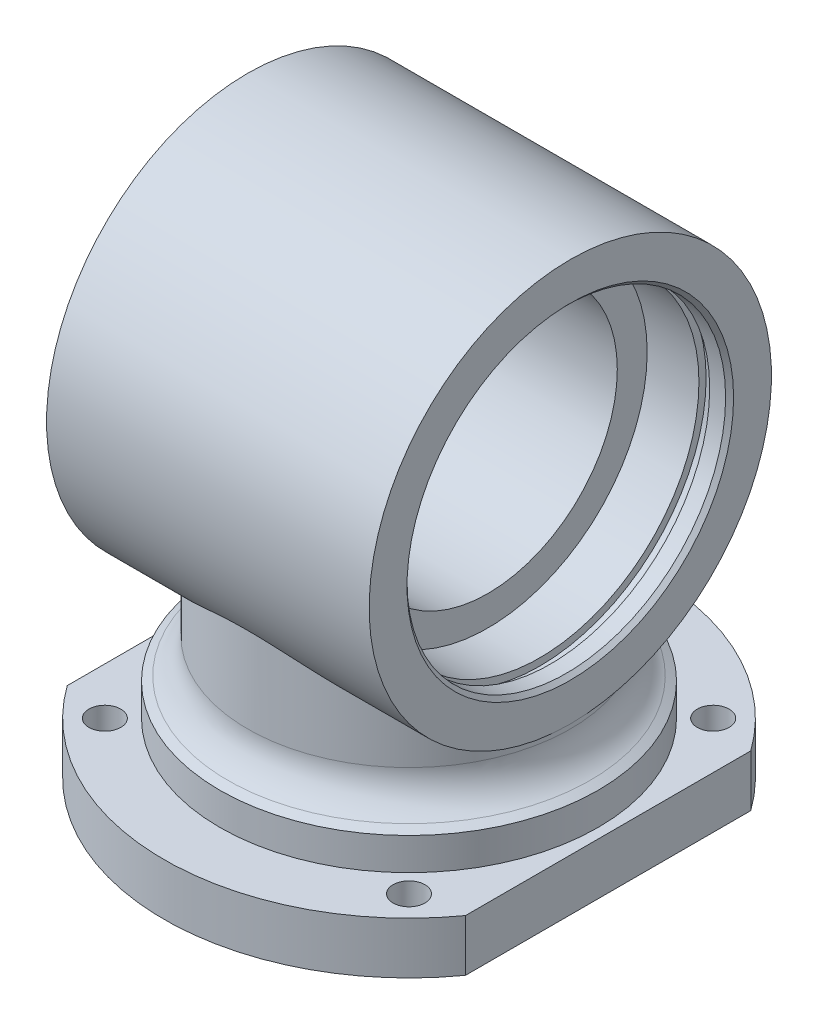
ISO-10303-21;
HEADER;
FILE_DESCRIPTION(('STEP AP214'),'2;1');
FILE_NAME('part.step','',(''),(''),'','','');
FILE_SCHEMA(('AUTOMOTIVE_DESIGN { 1 0 10303 214 1 1 1 1 }'));
ENDSEC;
DATA;
#1=APPLICATION_CONTEXT('core data for automotive mechanical design processes');
#2=APPLICATION_PROTOCOL_DEFINITION('international standard','automotive_design',2000,#1);
#3=PRODUCT_CONTEXT('',#1,'mechanical');
#4=PRODUCT('Part','Part','',(#3));
#5=PRODUCT_RELATED_PRODUCT_CATEGORY('part','',(#4));
#6=PRODUCT_DEFINITION_FORMATION('','',#4);
#7=PRODUCT_DEFINITION_CONTEXT('part definition',#1,'design');
#8=PRODUCT_DEFINITION('design','',#6,#7);
#9=PRODUCT_DEFINITION_SHAPE('','',#8);
#10=(LENGTH_UNIT() NAMED_UNIT(*) SI_UNIT(.MILLI.,.METRE.));
#11=(NAMED_UNIT(*) PLANE_ANGLE_UNIT() SI_UNIT($,.RADIAN.));
#12=(NAMED_UNIT(*) SI_UNIT($,.STERADIAN.) SOLID_ANGLE_UNIT());
#13=UNCERTAINTY_MEASURE_WITH_UNIT(LENGTH_MEASURE(1.E-05),#10,'distance_accuracy_value','');
#14=(GEOMETRIC_REPRESENTATION_CONTEXT(3) GLOBAL_UNCERTAINTY_ASSIGNED_CONTEXT((#13)) GLOBAL_UNIT_ASSIGNED_CONTEXT((#10,
#11,#12)) REPRESENTATION_CONTEXT('',''));
#15=CARTESIAN_POINT('',(0.,0.,0.));
#16=DIRECTION('',(0.,0.,1.));
#17=DIRECTION('',(1.,0.,0.));
#18=AXIS2_PLACEMENT_3D('',#15,#16,#17);
#19=CARTESIAN_POINT('',(0.,22.2376043070339,0.));
#20=DIRECTION('',(0.,-1.,0.));
#21=DIRECTION('',(0.,0.,-1.));
#22=AXIS2_PLACEMENT_3D('',#19,#20,#21);
#23=CONICAL_SURFACE('',#22,45.5,1.0471975511966);
#24=CARTESIAN_POINT('',(0.,22.2376043070339,0.));
#25=DIRECTION('',(0.,-1.,0.));
#26=DIRECTION('',(0.,0.,-1.));
#27=AXIS2_PLACEMENT_3D('',#24,#25,#26);
#28=CIRCLE('',#27,45.5);
#29=CARTESIAN_POINT('',(0.,22.2376043070339,-45.5));
#30=VERTEX_POINT('',#29);
#31=EDGE_CURVE('E106',#30,#30,#28,.T.);
#32=ORIENTED_EDGE('',*,*,#31,.T.);
#33=EDGE_LOOP('',(#32));
#34=FACE_BOUND('',#33,.T.);
#35=CARTESIAN_POINT('',(0.,21.0829037686547,0.));
#36=DIRECTION('',(0.,-1.,0.));
#37=DIRECTION('',(0.,0.,-1.));
#38=AXIS2_PLACEMENT_3D('',#35,#36,#37);
#39=CIRCLE('',#38,47.5);
#40=CARTESIAN_POINT('',(0.,21.0829037686547,-47.5));
#41=VERTEX_POINT('',#40);
#42=EDGE_CURVE('E41',#41,#41,#39,.T.);
#43=ORIENTED_EDGE('',*,*,#42,.F.);
#44=EDGE_LOOP('',(#43));
#45=FACE_BOUND('',#44,.T.);
#46=ADVANCED_FACE('F36',(#34,#45),#23,.T.);
#47=CARTESIAN_POINT('',(0.,0.,0.));
#48=DIRECTION('',(0.,-1.,0.));
#49=DIRECTION('',(0.,0.,-1.));
#50=AXIS2_PLACEMENT_3D('',#47,#48,#49);
#51=CYLINDRICAL_SURFACE('',#50,40.5);
#52=CARTESIAN_POINT('',(0.,30.8978583448783,0.));
#53=DIRECTION('',(0.,-1.,0.));
#54=DIRECTION('',(0.,0.,-1.));
#55=AXIS2_PLACEMENT_3D('',#52,#53,#54);
#56=CIRCLE('',#55,40.5);
#57=CARTESIAN_POINT('',(0.,30.8978583448783,-40.5));
#58=VERTEX_POINT('',#57);
#59=EDGE_CURVE('E109',#58,#58,#56,.T.);
#60=ORIENTED_EDGE('',*,*,#59,.F.);
#61=EDGE_LOOP('',(#60));
#62=FACE_BOUND('',#61,.T.);
#63=CARTESIAN_POINT('',(0.,52.3337937420033,-40.5));
#64=CARTESIAN_POINT('',(-0.75802329418061,52.3337750434481,-40.4999922113569));
#65=CARTESIAN_POINT('',(-1.51630597117243,52.3050790728961,-40.4786610133598));
#66=CARTESIAN_POINT('',(-3.02659461385214,52.1917148590163,-40.3938439259972));
#67=CARTESIAN_POINT('',(-3.77859606603165,52.1070093748505,-40.3303299891196));
#68=CARTESIAN_POINT('',(-5.27237503478806,51.8854495107934,-40.1624021461835));
#69=CARTESIAN_POINT('',(-6.01411754267241,51.7484480415177,-40.0578728556314));
#70=CARTESIAN_POINT('',(-7.48077693415799,51.4283186480655,-39.810067039256));
#71=CARTESIAN_POINT('',(-8.20569397491863,51.2451911549217,-39.6667908755087));
#72=CARTESIAN_POINT('',(-9.8869693685481,50.7684090165722,-39.2871298556858));
#73=CARTESIAN_POINT('',(-10.8353355796175,50.4585154850432,-39.0357134056688));
#74=CARTESIAN_POINT('',(-12.6933965576141,49.7834638931027,-38.4716976266007));
#75=CARTESIAN_POINT('',(-13.603073460242,49.4182806507224,-38.1590703996812));
#76=CARTESIAN_POINT('',(-15.3849464168242,48.6466366713587,-37.4762038338348));
#77=CARTESIAN_POINT('',(-16.2570514384093,48.2400829144369,-37.1058336216683));
#78=CARTESIAN_POINT('',(-17.9620835194841,47.3989107675472,-36.3111317389673));
#79=CARTESIAN_POINT('',(-18.7950115997711,46.9642931095155,-35.8868014754883));
#80=CARTESIAN_POINT('',(-20.164471341701,46.2179222823657,-35.1290114275756));
#81=CARTESIAN_POINT('',(-20.7112928431995,45.9108740852239,-34.8093613947356));
#82=CARTESIAN_POINT('',(-21.7871556159563,45.2913066959495,-34.1462901398819));
#83=CARTESIAN_POINT('',(-22.3161957131973,44.9787871446344,-33.8028673528342));
#84=CARTESIAN_POINT('',(-23.877000749312,44.0367570604307,-32.7372430453983));
#85=CARTESIAN_POINT('',(-24.882339365491,43.4028367054605,-31.979747191873));
#86=CARTESIAN_POINT('',(-26.8197860187297,42.1420831106904,-30.3732016713229));
#87=CARTESIAN_POINT('',(-27.7519530813989,41.5152445150731,-29.524227137359));
#88=CARTESIAN_POINT('',(-29.5401013526547,40.283917141096,-27.7350122862182));
#89=CARTESIAN_POINT('',(-30.3961080849724,39.6794209151072,-26.7948027672877));
#90=CARTESIAN_POINT('',(-31.8640698717643,38.623884552693,-25.0196219298184));
#91=CARTESIAN_POINT('',(-32.4907587316837,38.1661855016421,-24.2007563901082));
#92=CARTESIAN_POINT('',(-33.6868691210082,37.2822738738803,-22.5060051312726));
#93=CARTESIAN_POINT('',(-34.2562932128411,36.8560598885333,-21.6301219664078));
#94=CARTESIAN_POINT('',(-35.3319160130584,36.0433491097758,-19.8244451958978));
#95=CARTESIAN_POINT('',(-35.8381937606098,35.6568027747524,-18.8947211615576));
#96=CARTESIAN_POINT('',(-36.7823600055007,34.9305665591263,-16.9836173019974));
#97=CARTESIAN_POINT('',(-37.2202599091171,34.5908688646929,-16.0022461287603));
#98=CARTESIAN_POINT('',(-37.9562920469115,34.0166404020164,-14.1559500523331));
#99=CARTESIAN_POINT('',(-38.2655736356299,33.7739893092323,-13.297984098753));
#100=CARTESIAN_POINT('',(-38.8280062937797,33.3310666622906,-11.5531714825737));
#101=CARTESIAN_POINT('',(-39.0811631142039,33.1307907661274,-10.666327789709));
#102=CARTESIAN_POINT('',(-39.5278110157235,32.7764707826585,-8.86900395599769));
#103=CARTESIAN_POINT('',(-39.7213248706485,32.6224090497251,-7.9585329812326));
#104=CARTESIAN_POINT('',(-40.0458834472675,32.363554321239,-6.11955201514369));
#105=CARTESIAN_POINT('',(-40.1769274246146,32.258761912745,-5.1910418090143));
#106=CARTESIAN_POINT('',(-40.3747407215134,32.1004350250512,-3.31946754808093));
#107=CARTESIAN_POINT('',(-40.4412800806743,32.047083938913,-2.37636351232222));
#108=CARTESIAN_POINT('',(-40.5081190145199,31.9934924599538,-0.486290173846984));
#109=CARTESIAN_POINT('',(-40.5084184610373,31.9932521698966,0.460679136344903));
#110=CARTESIAN_POINT('',(-40.4427724756546,32.0458875222548,2.35084820307118));
#111=CARTESIAN_POINT('',(-40.3768250620962,32.0987647535875,3.29404784599523));
#112=CARTESIAN_POINT('',(-40.1798234459991,32.2564459185137,5.16918919098058));
#113=CARTESIAN_POINT('',(-40.0487707844166,32.3612486230989,6.10113115896159));
#114=CARTESIAN_POINT('',(-39.7327427747458,32.6133052558598,7.89575277400725));
#115=CARTESIAN_POINT('',(-39.5511543842316,32.7578877685871,8.75941055535299));
#116=CARTESIAN_POINT('',(-39.1343248426264,33.0886723457473,10.4654524828908));
#117=CARTESIAN_POINT('',(-38.899086129343,33.274872519115,11.3078375937569));
#118=CARTESIAN_POINT('',(-38.3778386386059,33.6857318199612,12.9671886371517));
#119=CARTESIAN_POINT('',(-38.0918231722196,33.9103960142501,13.7841512040286));
#120=CARTESIAN_POINT('',(-37.4721862678583,34.3946220959886,15.389132419124));
#121=CARTESIAN_POINT('',(-37.1385620062279,34.654186053274,16.1771493471021));
#122=CARTESIAN_POINT('',(-36.3928296962401,35.2308041357947,17.7955022478225));
#123=CARTESIAN_POINT('',(-35.9762660873086,35.5509829398174,18.6226699456453));
#124=CARTESIAN_POINT('',(-35.0938695017235,36.2236762314051,20.2365095024397));
#125=CARTESIAN_POINT('',(-34.6280339250683,36.5761924252312,21.023179221139));
#126=CARTESIAN_POINT('',(-33.6506325473966,37.3086260994993,22.5546099026243));
#127=CARTESIAN_POINT('',(-33.1390496281844,37.6885538267026,23.2993550063453));
#128=CARTESIAN_POINT('',(-32.0735675434638,38.4706591530427,24.7455673230315));
#129=CARTESIAN_POINT('',(-31.5196663359164,38.8728378256245,25.4470324445959));
#130=CARTESIAN_POINT('',(-30.2538837732792,39.7792348676783,26.9463088253195));
#131=CARTESIAN_POINT('',(-29.5329845365055,40.2873878263023,27.7341433611329));
#132=CARTESIAN_POINT('',(-28.0372458899272,41.3199780186881,29.2454018174231));
#133=CARTESIAN_POINT('',(-27.2623976594084,41.8444179075775,29.9688151606965));
#134=CARTESIAN_POINT('',(-25.660337874725,42.9008879282004,31.3515245754771));
#135=CARTESIAN_POINT('',(-24.8330651987446,43.4329263379524,32.0107434445621));
#136=CARTESIAN_POINT('',(-23.1282905708711,44.4937861531736,33.2633582555588));
#137=CARTESIAN_POINT('',(-22.2507944694185,45.0226079254362,33.856761840617));
#138=CARTESIAN_POINT('',(-20.5275917596231,46.0180395302848,34.925641348456));
#139=CARTESIAN_POINT('',(-19.6862364745231,46.4859374212484,35.4069329562272));
#140=CARTESIAN_POINT('',(-17.9612415488273,47.3991372698119,36.3124326191854));
#141=CARTESIAN_POINT('',(-17.0775968081363,47.8444364886085,36.7366337656442));
#142=CARTESIAN_POINT('',(-15.2688834995669,48.6990460212585,37.5244274588095));
#143=CARTESIAN_POINT('',(-14.3438884100041,49.108416620337,37.8881224852806));
#144=CARTESIAN_POINT('',(-12.4510151041331,49.8766846553503,38.5516129052417));
#145=CARTESIAN_POINT('',(-11.4831572051651,50.235605675089,38.8514381901174));
#146=CARTESIAN_POINT('',(-9.81027611814595,50.7852748700708,39.3002645838339));
#147=CARTESIAN_POINT('',(-9.1159086913314,50.9938042251483,39.4672977663315));
#148=CARTESIAN_POINT('',(-7.70907699458797,51.3716993430894,39.7660276513));
#149=CARTESIAN_POINT('',(-6.99661520171988,51.5410704348612,39.8977291623236));
#150=CARTESIAN_POINT('',(-5.55784634956763,51.8341415183988,40.1234274007538));
#151=CARTESIAN_POINT('',(-4.83156896336553,51.9579298318335,40.2174970748975));
#152=CARTESIAN_POINT('',(-3.36812759453926,52.1550023794632,40.3664031556732));
#153=CARTESIAN_POINT('',(-2.63096386198812,52.2282877719363,40.4212404620956));
#154=CARTESIAN_POINT('',(-1.14675676756293,52.3211443642203,40.4906180399327));
#155=CARTESIAN_POINT('',(-0.399680533143528,52.3403828372574,40.5049087010787));
#156=CARTESIAN_POINT('',(1.0934498637854,52.3232159120379,40.492120158718));
#157=CARTESIAN_POINT('',(1.83950404408775,52.2868114951066,40.4650416848029));
#158=CARTESIAN_POINT('',(3.32523387066814,52.1601166046608,40.3701331044911));
#159=CARTESIAN_POINT('',(4.06490093235194,52.0697624699451,40.3022548533212));
#160=CARTESIAN_POINT('',(5.5317059105796,51.8393637196861,40.1272492929037));
#161=CARTESIAN_POINT('',(6.25884187895741,51.6993114495302,40.0201159374186));
#162=CARTESIAN_POINT('',(7.87563408405467,51.3349475464879,39.7373259181));
#163=CARTESIAN_POINT('',(8.76069487488065,51.0983401813025,39.5512508600009));
#164=CARTESIAN_POINT('',(10.5005547670315,50.5692373394783,39.1253292812276));
#165=CARTESIAN_POINT('',(11.3553444448201,50.276724637413,38.8854661835456));
#166=CARTESIAN_POINT('',(13.0346895971788,49.647367715547,38.3552371057517));
#167=CARTESIAN_POINT('',(13.8591651606817,49.3104157595844,38.0647478217122));
#168=CARTESIAN_POINT('',(15.4754053305427,48.6036913421343,37.4367950374864));
#169=CARTESIAN_POINT('',(16.2671684121871,48.2339173533502,37.0993293509474));
#170=CARTESIAN_POINT('',(17.6112499714004,47.5727698973291,36.4758356139686));
#171=CARTESIAN_POINT('',(18.1710786614476,47.2868096956802,36.2001155002135));
#172=CARTESIAN_POINT('',(19.2736343137144,46.7053982686125,35.6253219868922));
#173=CARTESIAN_POINT('',(19.8163597297876,46.4099461899701,35.3262464844363));
#174=CARTESIAN_POINT('',(20.885012354052,45.8122983522315,34.7051629726217));
#175=CARTESIAN_POINT('',(21.4109335182145,45.5101002316986,34.3831468436939));
#176=CARTESIAN_POINT('',(22.445818516913,44.9015984130506,33.7166718119611));
#177=CARTESIAN_POINT('',(22.9547827910714,44.5952948216627,33.3722134916751));
#178=CARTESIAN_POINT('',(24.4573026509207,43.6730455298615,32.3048226740633));
#179=CARTESIAN_POINT('',(25.4256244775364,43.0542503364695,31.5483754935656));
#180=CARTESIAN_POINT('',(27.2926363306201,41.8257457791782,29.9478437196006));
#181=CARTESIAN_POINT('',(28.1913373924465,41.2160349877656,29.1037730648789));
#182=CARTESIAN_POINT('',(29.9287586348054,40.0107862687172,27.3147948055351));
#183=CARTESIAN_POINT('',(30.7663409216615,39.4156115977441,26.3685335936417));
#184=CARTESIAN_POINT('',(32.3596777184496,38.2637480614726,24.3868185413875));
#185=CARTESIAN_POINT('',(33.1154193042414,37.7070652797491,23.3513506598895));
#186=CARTESIAN_POINT('',(34.1795941237853,36.9128370295747,21.7352286915364));
#187=CARTESIAN_POINT('',(34.5223768231223,36.6551779976516,21.1867293934389));
#188=CARTESIAN_POINT('',(35.1840163850207,36.1549025203481,20.0688004895389));
#189=CARTESIAN_POINT('',(35.5028747140541,35.91228515313,19.4993721697979));
#190=CARTESIAN_POINT('',(36.1150907884664,35.4440659288423,18.3406465602626));
#191=CARTESIAN_POINT('',(36.4084636971056,35.2184539646574,17.751361378598));
#192=CARTESIAN_POINT('',(36.9685280119838,34.78584659437,16.5534063332311));
#193=CARTESIAN_POINT('',(37.2352132362929,34.5788555027195,15.9447320210822));
#194=CARTESIAN_POINT('',(37.8301525129351,34.1153506697671,14.4895751326269));
#195=CARTESIAN_POINT('',(38.1465911972521,33.8673907099094,13.6354751268588));
#196=CARTESIAN_POINT('',(38.7237322606189,33.4133858561668,11.897902474126));
#197=CARTESIAN_POINT('',(38.9844491828228,33.2073300261562,11.0144375610117));
#198=CARTESIAN_POINT('',(39.3310684322827,32.9325909622814,9.6711440405711));
#199=CARTESIAN_POINT('',(39.4391894119687,32.8467429151786,9.22041389754475));
#200=CARTESIAN_POINT('',(39.6402562158355,32.6868872867852,8.31358961546612));
#201=CARTESIAN_POINT('',(39.7332046596403,32.6128776615685,7.85749641698462));
#202=CARTESIAN_POINT('',(39.9887716049262,32.4091711951478,6.48207342657127));
#203=CARTESIAN_POINT('',(40.1281357260797,32.2977776926746,5.55550751651664));
#204=CARTESIAN_POINT('',(40.3428555865627,32.1259803665182,3.68676342001864));
#205=CARTESIAN_POINT('',(40.4179644002407,32.0657732516155,2.74453906570424));
#206=CARTESIAN_POINT('',(40.5020073317987,31.9983965139518,0.855207437516075));
#207=CARTESIAN_POINT('',(40.5109417045185,31.9912266869424,-0.0918998175394314));
#208=CARTESIAN_POINT('',(40.4624697278519,32.0300955686247,-1.98334499753783));
#209=CARTESIAN_POINT('',(40.4050600818269,32.0761369213834,-2.92768278252791));
#210=CARTESIAN_POINT('',(40.2248943917819,32.2203896607818,-4.8060382872885));
#211=CARTESIAN_POINT('',(40.1021399194952,32.3185997926104,-5.74005625472912));
#212=CARTESIAN_POINT('',(39.801995602315,32.5581219870383,-7.53894442366305));
#213=CARTESIAN_POINT('',(39.6280497504661,32.6967127863839,-8.40475810271103));
#214=CARTESIAN_POINT('',(39.2261800880092,33.0158783269948,-10.1157828337963));
#215=CARTESIAN_POINT('',(38.9982587447024,33.1964511491915,-10.9609948256207));
#216=CARTESIAN_POINT('',(38.491268536072,33.5964878104206,-12.6265688870689));
#217=CARTESIAN_POINT('',(38.2121925043924,33.8159570983887,-13.446927456143));
#218=CARTESIAN_POINT('',(37.6060336456565,34.2902690224755,-15.0591523072466));
#219=CARTESIAN_POINT('',(37.2789480272363,34.5451137153371,-15.8510169292511));
#220=CARTESIAN_POINT('',(36.5483056278,35.1109668427163,-17.4737870282093));
#221=CARTESIAN_POINT('',(36.1405063779728,35.4249712850091,-18.3017356497386));
#222=CARTESIAN_POINT('',(35.2756323718394,36.085644965118,-19.9178290532742));
#223=CARTESIAN_POINT('',(34.8185551694064,36.4323158243669,-20.7059718564903));
#224=CARTESIAN_POINT('',(33.8586832433775,37.1534452635136,-22.2409363466761));
#225=CARTESIAN_POINT('',(33.3558734039994,37.5279130234087,-22.9877442392693));
#226=CARTESIAN_POINT('',(32.3079461108366,38.2995733119027,-24.4386493273434));
#227=CARTESIAN_POINT('',(31.7628265766397,38.6967669577046,-25.1427444195545));
#228=CARTESIAN_POINT('',(30.5177502613628,39.591851302316,-26.6468535487532));
#229=CARTESIAN_POINT('',(29.80889418632,40.0937529458063,-27.4371283044651));
#230=CARTESIAN_POINT('',(28.3376015600759,41.1147500658443,-28.9542277043793));
#231=CARTESIAN_POINT('',(27.5751565744987,41.6338482421321,-29.6810423200236));
#232=CARTESIAN_POINT('',(25.9983468159311,42.6808354699377,-31.0715686226139));
#233=CARTESIAN_POINT('',(25.1839191242348,43.2087345805424,-31.7352013198996));
#234=CARTESIAN_POINT('',(23.5054301046463,44.2628659231511,-32.997690409715));
#235=CARTESIAN_POINT('',(22.6413738120723,44.7890983185636,-33.5965533560719));
#236=CARTESIAN_POINT('',(20.9225429494445,45.7944211540221,-34.6910004519288));
#237=CARTESIAN_POINT('',(20.0709278335718,46.2743289418236,-35.190794250681));
#238=CARTESIAN_POINT('',(18.3238074823224,47.2123457251636,-36.1313222357122));
#239=CARTESIAN_POINT('',(17.4282958059305,47.6704515021032,-36.5720477191573));
#240=CARTESIAN_POINT('',(15.5939320693001,48.5511541210417,-37.3910002693611));
#241=CARTESIAN_POINT('',(14.6551420202692,48.973799463632,-37.7693134080043));
#242=CARTESIAN_POINT('',(12.732915112689,49.7683280030705,-38.4599088597343));
#243=CARTESIAN_POINT('',(11.7495018692163,50.1402376417475,-38.7722256149837));
#244=CARTESIAN_POINT('',(10.0457932038281,50.7118747937049,-39.2410161713867));
#245=CARTESIAN_POINT('',(9.3365833554298,50.9295445484992,-39.4159837480808));
#246=CARTESIAN_POINT('',(7.89880791899144,51.3244698236379,-39.7290810860562));
#247=CARTESIAN_POINT('',(7.17024167505055,51.5017239725246,-39.8672095972728));
#248=CARTESIAN_POINT('',(5.69926801806071,51.8085339852058,-40.1038834691141));
#249=CARTESIAN_POINT('',(4.95691361580463,51.93824382618,-40.2025567058263));
#250=CARTESIAN_POINT('',(3.46089836381644,52.1449312639185,-40.3588511921235));
#251=CARTESIAN_POINT('',(2.70724569124006,52.2219452790875,-40.4165007944949));
#252=CARTESIAN_POINT('',(1.62651505022921,52.2917181002918,-40.4686324018567));
#253=CARTESIAN_POINT('',(1.30156700173369,52.3074770538659,-40.4803870790085));
#254=CARTESIAN_POINT('',(0.651095304730306,52.3285196819736,-40.4960731419848));
#255=CARTESIAN_POINT('',(0.325571576655205,52.3338017730469,-40.5000033452281));
#256=CARTESIAN_POINT('',(0.,52.3337937420033,-40.5));
#257=B_SPLINE_CURVE_WITH_KNOTS('',3,(#63,#64,#65,#66,#67,#68,#69,#70,#71,#72,#73,#74,#75,#76,
#77,#78,#79,#80,#81,#82,#83,#84,#85,#86,#87,#88,#89,#90,#91,#92,#93,#94,#95,#96,#97,#98,#99,
#100,#101,#102,#103,#104,#105,#106,#107,#108,#109,#110,#111,#112,#113,#114,#115,#116,#117,#118,
#119,#120,#121,#122,#123,#124,#125,#126,#127,#128,#129,#130,#131,#132,#133,#134,#135,#136,#137,
#138,#139,#140,#141,#142,#143,#144,#145,#146,#147,#148,#149,#150,#151,#152,#153,#154,#155,#156,
#157,#158,#159,#160,#161,#162,#163,#164,#165,#166,#167,#168,#169,#170,#171,#172,#173,#174,#175,
#176,#177,#178,#179,#180,#181,#182,#183,#184,#185,#186,#187,#188,#189,#190,#191,#192,#193,#194,
#195,#196,#197,#198,#199,#200,#201,#202,#203,#204,#205,#206,#207,#208,#209,#210,#211,#212,#213,
#214,#215,#216,#217,#218,#219,#220,#221,#222,#223,#224,#225,#226,#227,#228,#229,#230,#231,#232,
#233,#234,#235,#236,#237,#238,#239,#240,#241,#242,#243,#244,#245,#246,#247,#248,#249,#250,#251,
#252,#253,#254,#255,#256),.UNSPECIFIED.,.T.,.F.,(4,2,2,2,2,2,2,2,2,2,2,2,2,2,2,2,2,2,2,2,2,2,2,
2,2,2,2,2,2,2,2,2,2,2,2,2,2,2,2,2,2,2,2,2,2,2,2,2,2,2,2,2,2,2,2,2,2,2,2,2,2,2,2,2,2,2,2,2,2,2,2,
2,2,2,2,2,2,2,2,2,2,2,2,2,2,2,2,2,2,2,2,2,2,2,2,2,4),(0.,2.27369667628687,4.5489066602976,
6.83056369685689,9.11219941286111,12.1940106050682,15.2772296693116,18.3675411901415,
21.4577721449141,23.5688307319955,25.680028429012,29.9028459670296,34.122221291857,
38.3401772021522,41.7216689853877,45.1030093895482,48.4800740254921,51.8565747217565,
54.6849424660106,57.513020258989,60.3400168484774,63.1670471216176,66.0041191564384,
68.8411966807001,71.6783590736795,74.5154543179307,77.1954814739222,79.8753868768922,
82.5556455719711,85.2360632980562,88.173025711363,91.110143180789,94.0483643261117,
96.9867273428677,100.531256287105,104.076366132477,107.625688113181,111.17459747764,
114.401177702071,117.628148036508,120.849595916896,124.069532813718,126.299722645653,
128.529608800135,130.755151281083,132.980642717803,135.219805142953,137.458928078394,
139.700698437251,141.942814228328,144.74299025217,147.544030454966,150.351990657676,
153.160081590811,155.21875703593,157.277618055791,159.337211441173,161.396751388153,
165.519150237462,169.6408943162,173.826162719419,178.012091092036,180.100057721165,
182.187896261226,184.274483951821,186.361553865787,189.190566393592,192.018839656484,
193.432666425455,194.846248830463,197.673121627137,200.510809584398,203.348486613625,
206.186304653272,209.02405443822,211.702912886719,214.381648904178,217.060760477985,
219.740027881911,222.661884137577,225.583885499192,228.506856189691,231.429970696898,
234.949478840688,238.469542166816,241.99395000422,245.518000884679,248.809188152099,
252.100859794986,255.387953295387,258.673327068929,260.958083169575,263.242916789284,
265.520283954332,267.796075623107,268.772482498993,269.74903693659),.UNSPECIFIED.);
#258=CARTESIAN_POINT('',(-40.5,32.,0.));
#259=VERTEX_POINT('',#258);
#260=CARTESIAN_POINT('',(40.5,32.,0.));
#261=VERTEX_POINT('',#260);
#262=EDGE_CURVE('E126',#259,#261,#257,.T.);
#263=ORIENTED_EDGE('',*,*,#262,.F.);
#264=EDGE_CURVE('E118',#261,#259,#257,.T.);
#265=ORIENTED_EDGE('',*,*,#264,.F.);
#266=EDGE_LOOP('',(#263,#265));
#267=FACE_BOUND('',#266,.T.);
#268=ADVANCED_FACE('F129',(#62,#267),#51,.T.);
#269=CARTESIAN_POINT('',(0.,30.8978583448783,0.));
#270=DIRECTION('',(0.,-1.,0.));
#271=DIRECTION('',(0.,0.,-1.));
#272=AXIS2_PLACEMENT_3D('',#269,#270,#271);
#273=TOROIDAL_SURFACE('',#272,50.5,10.);
#274=ORIENTED_EDGE('',*,*,#31,.F.);
#275=EDGE_LOOP('',(#274));
#276=FACE_BOUND('',#275,.T.);
#277=ORIENTED_EDGE('',*,*,#59,.T.);
#278=EDGE_LOOP('',(#277));
#279=FACE_BOUND('',#278,.T.);
#280=ADVANCED_FACE('F139',(#276,#279),#273,.F.);
#281=CARTESIAN_POINT('',(40.5,82.5,0.));
#282=DIRECTION('',(-1.,0.,0.));
#283=DIRECTION('',(0.,0.,1.));
#284=AXIS2_PLACEMENT_3D('',#281,#282,#283);
#285=CYLINDRICAL_SURFACE('',#284,50.5);
#286=CARTESIAN_POINT('',(-40.5,82.5,0.));
#287=DIRECTION('',(1.,0.,0.));
#288=DIRECTION('',(0.,0.,-1.));
#289=AXIS2_PLACEMENT_3D('',#286,#287,#288);
#290=CIRCLE('',#289,50.5);
#291=EDGE_CURVE('E103',#259,#259,#290,.T.);
#292=ORIENTED_EDGE('',*,*,#291,.T.);
#293=ORIENTED_EDGE('',*,*,#262,.T.);
#294=CARTESIAN_POINT('',(40.5,82.5,0.));
#295=DIRECTION('',(1.,0.,0.));
#296=DIRECTION('',(0.,0.,-1.));
#297=AXIS2_PLACEMENT_3D('',#294,#295,#296);
#298=CIRCLE('',#297,50.5);
#299=EDGE_CURVE('E170',#261,#261,#298,.T.);
#300=ORIENTED_EDGE('',*,*,#299,.F.);
#301=ORIENTED_EDGE('',*,*,#264,.T.);
#302=EDGE_LOOP('',(#292,#293,#300,#301));
#303=FACE_BOUND('',#302,.T.);
#304=ADVANCED_FACE('F133',(#303),#285,.T.);
#305=CARTESIAN_POINT('',(40.5,82.5,0.));
#306=DIRECTION('',(1.,0.,0.));
#307=DIRECTION('',(0.,0.,-1.));
#308=AXIS2_PLACEMENT_3D('',#305,#306,#307);
#309=PLANE('',#308);
#310=CARTESIAN_POINT('',(40.5,82.5,0.));
#311=DIRECTION('',(1.,0.,0.));
#312=DIRECTION('',(0.,0.,-1.));
#313=AXIS2_PLACEMENT_3D('',#310,#311,#312);
#314=CIRCLE('',#313,41.);
#315=CARTESIAN_POINT('',(40.5,82.5,-41.));
#316=VERTEX_POINT('',#315);
#317=EDGE_CURVE('E260',#316,#316,#314,.F.);
#318=ORIENTED_EDGE('',*,*,#317,.T.);
#319=EDGE_LOOP('',(#318));
#320=FACE_BOUND('',#319,.T.);
#321=ORIENTED_EDGE('',*,*,#299,.T.);
#322=EDGE_LOOP('',(#321));
#323=FACE_BOUND('',#322,.T.);
#324=ADVANCED_FACE('F138',(#320,#323),#309,.T.);
#325=CARTESIAN_POINT('',(-40.5,82.5,0.));
#326=DIRECTION('',(1.,0.,0.));
#327=DIRECTION('',(0.,0.,-1.));
#328=AXIS2_PLACEMENT_3D('',#325,#326,#327);
#329=PLANE('',#328);
#330=CARTESIAN_POINT('',(-40.5,82.5,0.));
#331=DIRECTION('',(1.,0.,0.));
#332=DIRECTION('',(0.,0.,-1.));
#333=AXIS2_PLACEMENT_3D('',#330,#331,#332);
#334=CIRCLE('',#333,41.0000000000001);
#335=CARTESIAN_POINT('',(-40.5,82.5,-41.0000000000001));
#336=VERTEX_POINT('',#335);
#337=EDGE_CURVE('E251',#336,#336,#334,.T.);
#338=ORIENTED_EDGE('',*,*,#337,.T.);
#339=EDGE_LOOP('',(#338));
#340=FACE_BOUND('',#339,.T.);
#341=ORIENTED_EDGE('',*,*,#291,.F.);
#342=EDGE_LOOP('',(#341));
#343=FACE_BOUND('',#342,.T.);
#344=ADVANCED_FACE('F141',(#340,#343),#329,.F.);
#345=CARTESIAN_POINT('',(19.8,0.,0.));
#346=DIRECTION('',(-1.,0.,0.));
#347=DIRECTION('',(0.,0.,1.));
#348=AXIS2_PLACEMENT_3D('',#345,#346,#347);
#349=PLANE('',#348);
#350=CARTESIAN_POINT('',(19.8,82.5,0.));
#351=DIRECTION('',(-1.,0.,0.));
#352=DIRECTION('',(0.,0.,1.));
#353=AXIS2_PLACEMENT_3D('',#350,#351,#352);
#354=CIRCLE('',#353,40.);
#355=CARTESIAN_POINT('',(19.8,82.5,40.));
#356=VERTEX_POINT('',#355);
#357=EDGE_CURVE('E213',#356,#356,#354,.T.);
#358=ORIENTED_EDGE('',*,*,#357,.F.);
#359=EDGE_LOOP('',(#358));
#360=FACE_BOUND('',#359,.T.);
#361=CARTESIAN_POINT('',(19.8,82.5,0.));
#362=DIRECTION('',(-1.,0.,0.));
#363=DIRECTION('',(0.,0.,1.));
#364=AXIS2_PLACEMENT_3D('',#361,#362,#363);
#365=CIRCLE('',#364,32.5);
#366=CARTESIAN_POINT('',(19.8,82.5,32.5));
#367=VERTEX_POINT('',#366);
#368=EDGE_CURVE('E180',#367,#367,#365,.T.);
#369=ORIENTED_EDGE('',*,*,#368,.T.);
#370=EDGE_LOOP('',(#369));
#371=FACE_BOUND('',#370,.T.);
#372=ADVANCED_FACE('F282',(#360,#371),#349,.F.);
#373=CARTESIAN_POINT('',(40.5,82.5,0.));
#374=DIRECTION('',(-1.,0.,0.));
#375=DIRECTION('',(0.,0.,1.));
#376=AXIS2_PLACEMENT_3D('',#373,#374,#375);
#377=CYLINDRICAL_SURFACE('',#376,32.5);
#378=ORIENTED_EDGE('',*,*,#368,.F.);
#379=EDGE_LOOP('',(#378));
#380=FACE_BOUND('',#379,.T.);
#381=CARTESIAN_POINT('',(-19.8,82.5,0.));
#382=DIRECTION('',(-1.,0.,0.));
#383=DIRECTION('',(0.,0.,1.));
#384=AXIS2_PLACEMENT_3D('',#381,#382,#383);
#385=CIRCLE('',#384,32.5);
#386=CARTESIAN_POINT('',(-19.8,82.5,32.5));
#387=VERTEX_POINT('',#386);
#388=EDGE_CURVE('E183',#387,#387,#385,.T.);
#389=ORIENTED_EDGE('',*,*,#388,.T.);
#390=EDGE_LOOP('',(#389));
#391=FACE_BOUND('',#390,.T.);
#392=ADVANCED_FACE('F348',(#380,#391),#377,.F.);
#393=CARTESIAN_POINT('',(-19.8,0.,0.));
#394=DIRECTION('',(1.,0.,0.));
#395=DIRECTION('',(0.,0.,-1.));
#396=AXIS2_PLACEMENT_3D('',#393,#394,#395);
#397=PLANE('',#396);
#398=ORIENTED_EDGE('',*,*,#388,.F.);
#399=EDGE_LOOP('',(#398));
#400=FACE_BOUND('',#399,.T.);
#401=CARTESIAN_POINT('',(-19.8,82.5,0.));
#402=DIRECTION('',(-1.,0.,0.));
#403=DIRECTION('',(0.,0.,1.));
#404=AXIS2_PLACEMENT_3D('',#401,#402,#403);
#405=CIRCLE('',#404,40.);
#406=CARTESIAN_POINT('',(-19.8,82.5,40.));
#407=VERTEX_POINT('',#406);
#408=EDGE_CURVE('E186',#407,#407,#405,.T.);
#409=ORIENTED_EDGE('',*,*,#408,.T.);
#410=EDGE_LOOP('',(#409));
#411=FACE_BOUND('',#410,.T.);
#412=ADVANCED_FACE('F345',(#400,#411),#397,.F.);
#413=CARTESIAN_POINT('',(40.5,82.5,0.));
#414=DIRECTION('',(-1.,0.,0.));
#415=DIRECTION('',(0.,0.,1.));
#416=AXIS2_PLACEMENT_3D('',#413,#414,#415);
#417=CYLINDRICAL_SURFACE('',#416,40.);
#418=ORIENTED_EDGE('',*,*,#408,.F.);
#419=EDGE_LOOP('',(#418));
#420=FACE_BOUND('',#419,.T.);
#421=CARTESIAN_POINT('',(-32.8,82.5,0.));
#422=DIRECTION('',(-1.,0.,0.));
#423=DIRECTION('',(0.,0.,1.));
#424=AXIS2_PLACEMENT_3D('',#421,#422,#423);
#425=CIRCLE('',#424,40.);
#426=CARTESIAN_POINT('',(-32.8,82.5,40.));
#427=VERTEX_POINT('',#426);
#428=EDGE_CURVE('E189',#427,#427,#425,.T.);
#429=ORIENTED_EDGE('',*,*,#428,.T.);
#430=EDGE_LOOP('',(#429));
#431=FACE_BOUND('',#430,.T.);
#432=ADVANCED_FACE('F300',(#420,#431),#417,.F.);
#433=CARTESIAN_POINT('',(-32.8,0.,0.));
#434=DIRECTION('',(1.,0.,0.));
#435=DIRECTION('',(0.,0.,-1.));
#436=AXIS2_PLACEMENT_3D('',#433,#434,#435);
#437=PLANE('',#436);
#438=ORIENTED_EDGE('',*,*,#428,.F.);
#439=EDGE_LOOP('',(#438));
#440=FACE_BOUND('',#439,.T.);
#441=CARTESIAN_POINT('',(-32.8,82.5,0.));
#442=DIRECTION('',(-1.,0.,0.));
#443=DIRECTION('',(0.,0.,1.));
#444=AXIS2_PLACEMENT_3D('',#441,#442,#443);
#445=CIRCLE('',#444,41.8);
#446=CARTESIAN_POINT('',(-32.8,82.5,41.8));
#447=VERTEX_POINT('',#446);
#448=EDGE_CURVE('E192',#447,#447,#445,.T.);
#449=ORIENTED_EDGE('',*,*,#448,.T.);
#450=EDGE_LOOP('',(#449));
#451=FACE_BOUND('',#450,.T.);
#452=ADVANCED_FACE('F340',(#440,#451),#437,.F.);
#453=CARTESIAN_POINT('',(40.5,82.5,0.));
#454=DIRECTION('',(-1.,0.,0.));
#455=DIRECTION('',(0.,0.,1.));
#456=AXIS2_PLACEMENT_3D('',#453,#454,#455);
#457=CYLINDRICAL_SURFACE('',#456,41.8);
#458=ORIENTED_EDGE('',*,*,#448,.F.);
#459=EDGE_LOOP('',(#458));
#460=FACE_BOUND('',#459,.T.);
#461=CARTESIAN_POINT('',(-35.5,82.5,0.));
#462=DIRECTION('',(-1.,0.,0.));
#463=DIRECTION('',(0.,0.,1.));
#464=AXIS2_PLACEMENT_3D('',#461,#462,#463);
#465=CIRCLE('',#464,41.8);
#466=CARTESIAN_POINT('',(-35.5,82.5,41.8));
#467=VERTEX_POINT('',#466);
#468=EDGE_CURVE('E195',#467,#467,#465,.T.);
#469=ORIENTED_EDGE('',*,*,#468,.T.);
#470=EDGE_LOOP('',(#469));
#471=FACE_BOUND('',#470,.T.);
#472=ADVANCED_FACE('F336',(#460,#471),#457,.F.);
#473=CARTESIAN_POINT('',(-35.5,0.,0.));
#474=DIRECTION('',(-1.,0.,0.));
#475=DIRECTION('',(0.,0.,1.));
#476=AXIS2_PLACEMENT_3D('',#473,#474,#475);
#477=PLANE('',#476);
#478=ORIENTED_EDGE('',*,*,#468,.F.);
#479=EDGE_LOOP('',(#478));
#480=FACE_BOUND('',#479,.T.);
#481=CARTESIAN_POINT('',(-35.5,82.5,0.));
#482=DIRECTION('',(-1.,0.,0.));
#483=DIRECTION('',(0.,0.,1.));
#484=AXIS2_PLACEMENT_3D('',#481,#482,#483);
#485=CIRCLE('',#484,40.);
#486=CARTESIAN_POINT('',(-35.5,82.5,40.));
#487=VERTEX_POINT('',#486);
#488=EDGE_CURVE('E198',#487,#487,#485,.T.);
#489=ORIENTED_EDGE('',*,*,#488,.T.);
#490=EDGE_LOOP('',(#489));
#491=FACE_BOUND('',#490,.T.);
#492=ADVANCED_FACE('F332',(#480,#491),#477,.F.);
#493=CARTESIAN_POINT('',(40.5,82.5,0.));
#494=DIRECTION('',(-1.,0.,0.));
#495=DIRECTION('',(0.,0.,1.));
#496=AXIS2_PLACEMENT_3D('',#493,#494,#495);
#497=CYLINDRICAL_SURFACE('',#496,40.);
#498=CARTESIAN_POINT('',(-39.5,82.5,0.));
#499=DIRECTION('',(1.,0.,0.));
#500=DIRECTION('',(0.,0.,-1.));
#501=AXIS2_PLACEMENT_3D('',#498,#499,#500);
#502=CIRCLE('',#501,40.);
#503=CARTESIAN_POINT('',(-39.5,82.5,-40.));
#504=VERTEX_POINT('',#503);
#505=EDGE_CURVE('E254',#504,#504,#502,.F.);
#506=ORIENTED_EDGE('',*,*,#505,.T.);
#507=EDGE_LOOP('',(#506));
#508=FACE_BOUND('',#507,.T.);
#509=ORIENTED_EDGE('',*,*,#488,.F.);
#510=EDGE_LOOP('',(#509));
#511=FACE_BOUND('',#510,.T.);
#512=ADVANCED_FACE('F315',(#508,#511),#497,.F.);
#513=CARTESIAN_POINT('',(40.5,82.5,0.));
#514=DIRECTION('',(-1.,0.,0.));
#515=DIRECTION('',(0.,0.,1.));
#516=AXIS2_PLACEMENT_3D('',#513,#514,#515);
#517=CYLINDRICAL_SURFACE('',#516,40.);
#518=CARTESIAN_POINT('',(39.5,82.5,0.));
#519=DIRECTION('',(1.,0.,0.));
#520=DIRECTION('',(0.,0.,-1.));
#521=AXIS2_PLACEMENT_3D('',#518,#519,#520);
#522=CIRCLE('',#521,40.);
#523=CARTESIAN_POINT('',(39.5,82.5,-40.));
#524=VERTEX_POINT('',#523);
#525=EDGE_CURVE('E257',#524,#524,#522,.T.);
#526=ORIENTED_EDGE('',*,*,#525,.T.);
#527=EDGE_LOOP('',(#526));
#528=FACE_BOUND('',#527,.T.);
#529=CARTESIAN_POINT('',(35.5,82.5,0.));
#530=DIRECTION('',(-1.,0.,0.));
#531=DIRECTION('',(0.,0.,1.));
#532=AXIS2_PLACEMENT_3D('',#529,#530,#531);
#533=CIRCLE('',#532,40.);
#534=CARTESIAN_POINT('',(35.5,82.5,40.));
#535=VERTEX_POINT('',#534);
#536=EDGE_CURVE('E201',#535,#535,#533,.T.);
#537=ORIENTED_EDGE('',*,*,#536,.T.);
#538=EDGE_LOOP('',(#537));
#539=FACE_BOUND('',#538,.T.);
#540=ADVANCED_FACE('F311',(#528,#539),#517,.F.);
#541=CARTESIAN_POINT('',(35.5,0.,0.));
#542=DIRECTION('',(-1.,0.,0.));
#543=DIRECTION('',(0.,0.,1.));
#544=AXIS2_PLACEMENT_3D('',#541,#542,#543);
#545=PLANE('',#544);
#546=CARTESIAN_POINT('',(35.5,82.5,0.));
#547=DIRECTION('',(-1.,0.,0.));
#548=DIRECTION('',(0.,0.,1.));
#549=AXIS2_PLACEMENT_3D('',#546,#547,#548);
#550=CIRCLE('',#549,41.8);
#551=CARTESIAN_POINT('',(35.5,82.5,41.8));
#552=VERTEX_POINT('',#551);
#553=EDGE_CURVE('E204',#552,#552,#550,.T.);
#554=ORIENTED_EDGE('',*,*,#553,.T.);
#555=EDGE_LOOP('',(#554));
#556=FACE_BOUND('',#555,.T.);
#557=ORIENTED_EDGE('',*,*,#536,.F.);
#558=EDGE_LOOP('',(#557));
#559=FACE_BOUND('',#558,.T.);
#560=ADVANCED_FACE('F314',(#556,#559),#545,.T.);
#561=CARTESIAN_POINT('',(40.5,82.5,0.));
#562=DIRECTION('',(-1.,0.,0.));
#563=DIRECTION('',(0.,0.,1.));
#564=AXIS2_PLACEMENT_3D('',#561,#562,#563);
#565=CYLINDRICAL_SURFACE('',#564,41.8);
#566=CARTESIAN_POINT('',(32.8,82.5,0.));
#567=DIRECTION('',(-1.,0.,0.));
#568=DIRECTION('',(0.,0.,1.));
#569=AXIS2_PLACEMENT_3D('',#566,#567,#568);
#570=CIRCLE('',#569,41.8);
#571=CARTESIAN_POINT('',(32.8,82.5,41.8));
#572=VERTEX_POINT('',#571);
#573=EDGE_CURVE('E207',#572,#572,#570,.T.);
#574=ORIENTED_EDGE('',*,*,#573,.T.);
#575=EDGE_LOOP('',(#574));
#576=FACE_BOUND('',#575,.T.);
#577=ORIENTED_EDGE('',*,*,#553,.F.);
#578=EDGE_LOOP('',(#577));
#579=FACE_BOUND('',#578,.T.);
#580=ADVANCED_FACE('F320',(#576,#579),#565,.F.);
#581=CARTESIAN_POINT('',(32.8,0.,0.));
#582=DIRECTION('',(1.,0.,0.));
#583=DIRECTION('',(0.,0.,-1.));
#584=AXIS2_PLACEMENT_3D('',#581,#582,#583);
#585=PLANE('',#584);
#586=CARTESIAN_POINT('',(32.8,82.5,0.));
#587=DIRECTION('',(-1.,0.,0.));
#588=DIRECTION('',(0.,0.,1.));
#589=AXIS2_PLACEMENT_3D('',#586,#587,#588);
#590=CIRCLE('',#589,40.);
#591=CARTESIAN_POINT('',(32.8,82.5,40.));
#592=VERTEX_POINT('',#591);
#593=EDGE_CURVE('E210',#592,#592,#590,.T.);
#594=ORIENTED_EDGE('',*,*,#593,.T.);
#595=EDGE_LOOP('',(#594));
#596=FACE_BOUND('',#595,.T.);
#597=ORIENTED_EDGE('',*,*,#573,.F.);
#598=EDGE_LOOP('',(#597));
#599=FACE_BOUND('',#598,.T.);
#600=ADVANCED_FACE('F297',(#596,#599),#585,.T.);
#601=ORIENTED_EDGE('',*,*,#593,.F.);
#602=EDGE_LOOP('',(#601));
#603=FACE_BOUND('',#602,.T.);
#604=ORIENTED_EDGE('',*,*,#357,.T.);
#605=EDGE_LOOP('',(#604));
#606=FACE_BOUND('',#605,.T.);
#607=ADVANCED_FACE('F289',(#603,#606),#417,.F.);
#608=CARTESIAN_POINT('',(40.5,82.5,0.));
#609=DIRECTION('',(1.,0.,0.));
#610=DIRECTION('',(0.,0.,-1.));
#611=AXIS2_PLACEMENT_3D('',#608,#609,#610);
#612=CONICAL_SURFACE('',#611,41.,0.785398163397448);
#613=ORIENTED_EDGE('',*,*,#525,.F.);
#614=EDGE_LOOP('',(#613));
#615=FACE_BOUND('',#614,.T.);
#616=ORIENTED_EDGE('',*,*,#317,.F.);
#617=EDGE_LOOP('',(#616));
#618=FACE_BOUND('',#617,.T.);
#619=ADVANCED_FACE('F286',(#615,#618),#612,.F.);
#620=CARTESIAN_POINT('',(-39.5,82.5,0.));
#621=DIRECTION('',(-1.,0.,0.));
#622=DIRECTION('',(0.,0.,1.));
#623=AXIS2_PLACEMENT_3D('',#620,#621,#622);
#624=CONICAL_SURFACE('',#623,40.,0.785398163397462);
#625=ORIENTED_EDGE('',*,*,#337,.F.);
#626=EDGE_LOOP('',(#625));
#627=FACE_BOUND('',#626,.T.);
#628=ORIENTED_EDGE('',*,*,#505,.F.);
#629=EDGE_LOOP('',(#628));
#630=FACE_BOUND('',#629,.T.);
#631=ADVANCED_FACE('F288',(#627,#630),#624,.F.);
#632=CARTESIAN_POINT('',(0.,23.,0.));
#633=DIRECTION('',(0.,-1.,0.));
#634=DIRECTION('',(0.,0.,-1.));
#635=AXIS2_PLACEMENT_3D('',#632,#633,#634);
#636=CYLINDRICAL_SURFACE('',#635,47.5);
#637=CARTESIAN_POINT('',(0.,13.,0.));
#638=DIRECTION('',(0.,-1.,0.));
#639=DIRECTION('',(0.,0.,-1.));
#640=AXIS2_PLACEMENT_3D('',#637,#638,#639);
#641=CIRCLE('',#640,47.5);
#642=CARTESIAN_POINT('',(0.,13.,-47.5));
#643=VERTEX_POINT('',#642);
#644=EDGE_CURVE('E241',#643,#643,#641,.T.);
#645=ORIENTED_EDGE('',*,*,#644,.F.);
#646=EDGE_LOOP('',(#645));
#647=FACE_BOUND('',#646,.T.);
#648=ORIENTED_EDGE('',*,*,#42,.T.);
#649=EDGE_LOOP('',(#648));
#650=FACE_BOUND('',#649,.T.);
#651=ADVANCED_FACE('F295',(#647,#650),#636,.T.);
#652=CARTESIAN_POINT('',(0.,13.,0.));
#653=DIRECTION('',(0.,-1.,0.));
#654=DIRECTION('',(0.,0.,-1.));
#655=AXIS2_PLACEMENT_3D('',#652,#653,#654);
#656=PLANE('',#655);
#657=CARTESIAN_POINT('',(-38.1837661840736,13.,38.1837661840736));
#658=DIRECTION('',(0.,-1.,0.));
#659=DIRECTION('',(0.,0.,-1.));
#660=AXIS2_PLACEMENT_3D('',#657,#658,#659);
#661=CIRCLE('',#660,4.00000000000001);
#662=CARTESIAN_POINT('',(-38.1837661840736,13.,34.1837661840736));
#663=VERTEX_POINT('',#662);
#664=EDGE_CURVE('E94',#663,#663,#661,.F.);
#665=ORIENTED_EDGE('',*,*,#664,.F.);
#666=EDGE_LOOP('',(#665));
#667=FACE_BOUND('',#666,.T.);
#668=CARTESIAN_POINT('',(-38.1837661840736,13.,-38.1837661840736));
#669=DIRECTION('',(0.,-1.,0.));
#670=DIRECTION('',(0.,0.,-1.));
#671=AXIS2_PLACEMENT_3D('',#668,#669,#670);
#672=CIRCLE('',#671,4.00000000000001);
#673=CARTESIAN_POINT('',(-38.1837661840736,13.,-42.1837661840736));
#674=VERTEX_POINT('',#673);
#675=EDGE_CURVE('E237',#674,#674,#672,.F.);
#676=ORIENTED_EDGE('',*,*,#675,.F.);
#677=EDGE_LOOP('',(#676));
#678=FACE_BOUND('',#677,.T.);
#679=ORIENTED_EDGE('',*,*,#644,.T.);
#680=EDGE_LOOP('',(#679));
#681=FACE_BOUND('',#680,.T.);
#682=CARTESIAN_POINT('',(38.1837661840736,13.,38.1837661840736));
#683=DIRECTION('',(0.,-1.,0.));
#684=DIRECTION('',(0.,0.,-1.));
#685=AXIS2_PLACEMENT_3D('',#682,#683,#684);
#686=CIRCLE('',#685,4.00000000000001);
#687=CARTESIAN_POINT('',(38.1837661840736,13.,34.1837661840736));
#688=VERTEX_POINT('',#687);
#689=EDGE_CURVE('E240',#688,#688,#686,.F.);
#690=ORIENTED_EDGE('',*,*,#689,.F.);
#691=EDGE_LOOP('',(#690));
#692=FACE_BOUND('',#691,.T.);
#693=CARTESIAN_POINT('',(38.1837661840736,13.,-38.1837661840736));
#694=DIRECTION('',(0.,-1.,0.));
#695=DIRECTION('',(0.,0.,-1.));
#696=AXIS2_PLACEMENT_3D('',#693,#694,#695);
#697=CIRCLE('',#696,4.00000000000001);
#698=CARTESIAN_POINT('',(38.1837661840736,13.,-42.1837661840736));
#699=VERTEX_POINT('',#698);
#700=EDGE_CURVE('E234',#699,#699,#697,.F.);
#701=ORIENTED_EDGE('',*,*,#700,.F.);
#702=EDGE_LOOP('',(#701));
#703=FACE_BOUND('',#702,.T.);
#704=CARTESIAN_POINT('',(0.,13.,0.));
#705=DIRECTION('',(0.,-1.,0.));
#706=DIRECTION('',(0.,0.,-1.));
#707=AXIS2_PLACEMENT_3D('',#704,#705,#706);
#708=CIRCLE('',#707,61.5);
#709=CARTESIAN_POINT('',(-50.,13.,-35.8085185395877));
#710=VERTEX_POINT('',#709);
#711=CARTESIAN_POINT('',(50.0000000000001,13.,-35.8085185395877));
#712=VERTEX_POINT('',#711);
#713=EDGE_CURVE('E92',#710,#712,#708,.T.);
#714=ORIENTED_EDGE('',*,*,#713,.F.);
#715=DIRECTION('',(0.,0.,-1.));
#716=VECTOR('',#715,1.);
#717=CARTESIAN_POINT('',(-50.,13.,65.));
#718=LINE('',#717,#716);
#719=CARTESIAN_POINT('',(-50.,13.,35.8085185395877));
#720=VERTEX_POINT('',#719);
#721=EDGE_CURVE('E86',#720,#710,#718,.T.);
#722=ORIENTED_EDGE('',*,*,#721,.F.);
#723=CARTESIAN_POINT('',(50.,13.,35.8085185395877));
#724=VERTEX_POINT('',#723);
#725=EDGE_CURVE('E90',#724,#720,#708,.T.);
#726=ORIENTED_EDGE('',*,*,#725,.F.);
#727=DIRECTION('',(0.,0.,1.));
#728=VECTOR('',#727,1.);
#729=CARTESIAN_POINT('',(50.,13.,65.));
#730=LINE('',#729,#728);
#731=EDGE_CURVE('E93',#712,#724,#730,.T.);
#732=ORIENTED_EDGE('',*,*,#731,.F.);
#733=EDGE_LOOP('',(#714,#722,#726,#732));
#734=FACE_BOUND('',#733,.T.);
#735=ADVANCED_FACE('F88',(#667,#678,#681,#692,#703,#734),#656,.F.);
#736=CARTESIAN_POINT('',(0.,17.,0.));
#737=DIRECTION('',(0.,-1.,0.));
#738=DIRECTION('',(0.,0.,-1.));
#739=AXIS2_PLACEMENT_3D('',#736,#737,#738);
#740=PLANE('',#739);
#741=CARTESIAN_POINT('',(0.,17.,0.));
#742=DIRECTION('',(0.,-1.,0.));
#743=DIRECTION('',(0.,0.,-1.));
#744=AXIS2_PLACEMENT_3D('',#741,#742,#743);
#745=CIRCLE('',#744,39.5);
#746=CARTESIAN_POINT('',(0.,17.,-39.5));
#747=VERTEX_POINT('',#746);
#748=EDGE_CURVE('E46',#747,#747,#745,.T.);
#749=ORIENTED_EDGE('',*,*,#748,.T.);
#750=EDGE_LOOP('',(#749));
#751=FACE_BOUND('',#750,.T.);
#752=ADVANCED_FACE('F458',(#751),#740,.T.);
#753=CARTESIAN_POINT('',(0.,17.,0.));
#754=DIRECTION('',(0.,-1.,0.));
#755=DIRECTION('',(0.,0.,-1.));
#756=AXIS2_PLACEMENT_3D('',#753,#754,#755);
#757=CONICAL_SURFACE('',#756,39.5,0.78539816339745);
#758=CARTESIAN_POINT('',(0.,14.,0.));
#759=DIRECTION('',(0.,-1.,0.));
#760=DIRECTION('',(0.,0.,-1.));
#761=AXIS2_PLACEMENT_3D('',#758,#759,#760);
#762=CIRCLE('',#761,42.5);
#763=CARTESIAN_POINT('',(0.,14.,-42.5));
#764=VERTEX_POINT('',#763);
#765=EDGE_CURVE('E12',#764,#764,#762,.F.);
#766=ORIENTED_EDGE('',*,*,#765,.F.);
#767=EDGE_LOOP('',(#766));
#768=FACE_BOUND('',#767,.T.);
#769=ORIENTED_EDGE('',*,*,#748,.F.);
#770=EDGE_LOOP('',(#769));
#771=FACE_BOUND('',#770,.T.);
#772=ADVANCED_FACE('F39',(#768,#771),#757,.F.);
#773=CARTESIAN_POINT('',(0.,17.,0.));
#774=DIRECTION('',(0.,-1.,0.));
#775=DIRECTION('',(0.,0.,-1.));
#776=AXIS2_PLACEMENT_3D('',#773,#774,#775);
#777=CYLINDRICAL_SURFACE('',#776,42.5);
#778=ORIENTED_EDGE('',*,*,#765,.T.);
#779=EDGE_LOOP('',(#778));
#780=FACE_BOUND('',#779,.T.);
#781=CARTESIAN_POINT('',(0.,0.,0.));
#782=DIRECTION('',(0.,-1.,0.));
#783=DIRECTION('',(0.,0.,-1.));
#784=AXIS2_PLACEMENT_3D('',#781,#782,#783);
#785=CIRCLE('',#784,42.5);
#786=CARTESIAN_POINT('',(0.,0.,-42.5));
#787=VERTEX_POINT('',#786);
#788=EDGE_CURVE('E228',#787,#787,#785,.T.);
#789=ORIENTED_EDGE('',*,*,#788,.T.);
#790=EDGE_LOOP('',(#789));
#791=FACE_BOUND('',#790,.T.);
#792=ADVANCED_FACE('F267',(#780,#791),#777,.F.);
#793=CARTESIAN_POINT('',(50.,81.,65.));
#794=DIRECTION('',(-1.,0.,0.));
#795=DIRECTION('',(0.,0.,1.));
#796=AXIS2_PLACEMENT_3D('',#793,#794,#795);
#797=PLANE('',#796);
#798=DIRECTION('',(0.,-1.,0.));
#799=VECTOR('',#798,1.);
#800=CARTESIAN_POINT('',(50.0000000000001,0.,-35.8085185395877));
#801=LINE('',#800,#799);
#802=CARTESIAN_POINT('',(50.0000000000001,0.,-35.8085185395877));
#803=VERTEX_POINT('',#802);
#804=EDGE_CURVE('E176',#712,#803,#801,.T.);
#805=ORIENTED_EDGE('',*,*,#804,.F.);
#806=ORIENTED_EDGE('',*,*,#731,.T.);
#807=DIRECTION('',(0.,-1.,0.));
#808=VECTOR('',#807,1.);
#809=CARTESIAN_POINT('',(50.,0.,35.8085185395877));
#810=LINE('',#809,#808);
#811=CARTESIAN_POINT('',(50.,0.,35.8085185395877));
#812=VERTEX_POINT('',#811);
#813=EDGE_CURVE('E62',#812,#724,#810,.F.);
#814=ORIENTED_EDGE('',*,*,#813,.F.);
#815=DIRECTION('',(0.,0.,1.));
#816=VECTOR('',#815,1.);
#817=CARTESIAN_POINT('',(50.,0.,0.));
#818=LINE('',#817,#816);
#819=EDGE_CURVE('E127',#803,#812,#818,.T.);
#820=ORIENTED_EDGE('',*,*,#819,.F.);
#821=EDGE_LOOP('',(#805,#806,#814,#820));
#822=FACE_BOUND('',#821,.T.);
#823=ADVANCED_FACE('F265',(#822),#797,.F.);
#824=CARTESIAN_POINT('',(-50.,81.,65.));
#825=DIRECTION('',(1.,0.,0.));
#826=DIRECTION('',(0.,0.,-1.));
#827=AXIS2_PLACEMENT_3D('',#824,#825,#826);
#828=PLANE('',#827);
#829=DIRECTION('',(0.,-1.,0.));
#830=VECTOR('',#829,1.);
#831=CARTESIAN_POINT('',(-50.,0.,35.8085185395877));
#832=LINE('',#831,#830);
#833=CARTESIAN_POINT('',(-50.,0.,35.8085185395877));
#834=VERTEX_POINT('',#833);
#835=EDGE_CURVE('E97',#720,#834,#832,.T.);
#836=ORIENTED_EDGE('',*,*,#835,.F.);
#837=ORIENTED_EDGE('',*,*,#721,.T.);
#838=DIRECTION('',(0.,-1.,0.));
#839=VECTOR('',#838,1.);
#840=CARTESIAN_POINT('',(-50.,0.,-35.8085185395877));
#841=LINE('',#840,#839);
#842=CARTESIAN_POINT('',(-50.,0.,-35.8085185395877));
#843=VERTEX_POINT('',#842);
#844=EDGE_CURVE('E54',#843,#710,#841,.F.);
#845=ORIENTED_EDGE('',*,*,#844,.F.);
#846=DIRECTION('',(0.,0.,-1.));
#847=VECTOR('',#846,1.);
#848=CARTESIAN_POINT('',(-50.,0.,0.));
#849=LINE('',#848,#847);
#850=EDGE_CURVE('E99',#834,#843,#849,.T.);
#851=ORIENTED_EDGE('',*,*,#850,.F.);
#852=EDGE_LOOP('',(#836,#837,#845,#851));
#853=FACE_BOUND('',#852,.T.);
#854=ADVANCED_FACE('F98',(#853),#828,.F.);
#855=CARTESIAN_POINT('',(0.,0.,0.));
#856=DIRECTION('',(0.,-1.,0.));
#857=DIRECTION('',(0.,0.,-1.));
#858=AXIS2_PLACEMENT_3D('',#855,#856,#857);
#859=CYLINDRICAL_SURFACE('',#858,61.5);
#860=CARTESIAN_POINT('',(0.,0.,0.));
#861=DIRECTION('',(0.,-1.,0.));
#862=DIRECTION('',(0.,0.,-1.));
#863=AXIS2_PLACEMENT_3D('',#860,#861,#862);
#864=CIRCLE('',#863,61.5);
#865=EDGE_CURVE('E113',#843,#803,#864,.T.);
#866=ORIENTED_EDGE('',*,*,#865,.F.);
#867=ORIENTED_EDGE('',*,*,#844,.T.);
#868=ORIENTED_EDGE('',*,*,#713,.T.);
#869=ORIENTED_EDGE('',*,*,#804,.T.);
#870=EDGE_LOOP('',(#866,#867,#868,#869));
#871=FACE_BOUND('',#870,.T.);
#872=ADVANCED_FACE('F149',(#871),#859,.T.);
#873=ORIENTED_EDGE('',*,*,#725,.T.);
#874=ORIENTED_EDGE('',*,*,#835,.T.);
#875=EDGE_CURVE('E111',#812,#834,#864,.T.);
#876=ORIENTED_EDGE('',*,*,#875,.F.);
#877=ORIENTED_EDGE('',*,*,#813,.T.);
#878=EDGE_LOOP('',(#873,#874,#876,#877));
#879=FACE_BOUND('',#878,.T.);
#880=ADVANCED_FACE('F105',(#879),#859,.T.);
#881=CARTESIAN_POINT('',(-38.1837661840736,20.,38.1837661840736));
#882=DIRECTION('',(0.,-1.,0.));
#883=DIRECTION('',(0.,0.,-1.));
#884=AXIS2_PLACEMENT_3D('',#881,#882,#883);
#885=CYLINDRICAL_SURFACE('',#884,4.00000000000001);
#886=ORIENTED_EDGE('',*,*,#664,.T.);
#887=EDGE_LOOP('',(#886));
#888=FACE_BOUND('',#887,.T.);
#889=CARTESIAN_POINT('',(-38.1837661840736,0.,38.1837661840736));
#890=DIRECTION('',(0.,-1.,0.));
#891=DIRECTION('',(0.,0.,-1.));
#892=AXIS2_PLACEMENT_3D('',#889,#890,#891);
#893=CIRCLE('',#892,4.00000000000001);
#894=CARTESIAN_POINT('',(-38.1837661840736,0.,34.1837661840736));
#895=VERTEX_POINT('',#894);
#896=EDGE_CURVE('E216',#895,#895,#893,.T.);
#897=ORIENTED_EDGE('',*,*,#896,.T.);
#898=EDGE_LOOP('',(#897));
#899=FACE_BOUND('',#898,.T.);
#900=ADVANCED_FACE('F377',(#888,#899),#885,.F.);
#901=CARTESIAN_POINT('',(38.1837661840736,20.,-38.1837661840736));
#902=DIRECTION('',(0.,-1.,0.));
#903=DIRECTION('',(0.,0.,-1.));
#904=AXIS2_PLACEMENT_3D('',#901,#902,#903);
#905=CYLINDRICAL_SURFACE('',#904,4.00000000000001);
#906=ORIENTED_EDGE('',*,*,#700,.T.);
#907=EDGE_LOOP('',(#906));
#908=FACE_BOUND('',#907,.T.);
#909=CARTESIAN_POINT('',(38.1837661840736,0.,-38.1837661840736));
#910=DIRECTION('',(0.,-1.,0.));
#911=DIRECTION('',(0.,0.,-1.));
#912=AXIS2_PLACEMENT_3D('',#909,#910,#911);
#913=CIRCLE('',#912,4.00000000000001);
#914=CARTESIAN_POINT('',(38.1837661840736,0.,-42.1837661840736));
#915=VERTEX_POINT('',#914);
#916=EDGE_CURVE('E223',#915,#915,#913,.T.);
#917=ORIENTED_EDGE('',*,*,#916,.T.);
#918=EDGE_LOOP('',(#917));
#919=FACE_BOUND('',#918,.T.);
#920=ADVANCED_FACE('F522',(#908,#919),#905,.F.);
#921=CARTESIAN_POINT('',(-38.1837661840736,20.,-38.1837661840736));
#922=DIRECTION('',(0.,-1.,0.));
#923=DIRECTION('',(0.,0.,-1.));
#924=AXIS2_PLACEMENT_3D('',#921,#922,#923);
#925=CYLINDRICAL_SURFACE('',#924,4.00000000000001);
#926=ORIENTED_EDGE('',*,*,#675,.T.);
#927=EDGE_LOOP('',(#926));
#928=FACE_BOUND('',#927,.T.);
#929=CARTESIAN_POINT('',(-38.1837661840736,0.,-38.1837661840736));
#930=DIRECTION('',(0.,-1.,0.));
#931=DIRECTION('',(0.,0.,-1.));
#932=AXIS2_PLACEMENT_3D('',#929,#930,#931);
#933=CIRCLE('',#932,4.00000000000001);
#934=CARTESIAN_POINT('',(-38.1837661840736,0.,-42.1837661840736));
#935=VERTEX_POINT('',#934);
#936=EDGE_CURVE('E220',#935,#935,#933,.T.);
#937=ORIENTED_EDGE('',*,*,#936,.T.);
#938=EDGE_LOOP('',(#937));
#939=FACE_BOUND('',#938,.T.);
#940=ADVANCED_FACE('F147',(#928,#939),#925,.F.);
#941=CARTESIAN_POINT('',(0.,0.,0.));
#942=DIRECTION('',(0.,1.,0.));
#943=DIRECTION('',(0.,0.,1.));
#944=AXIS2_PLACEMENT_3D('',#941,#942,#943);
#945=PLANE('',#944);
#946=ORIENTED_EDGE('',*,*,#788,.F.);
#947=EDGE_LOOP('',(#946));
#948=FACE_BOUND('',#947,.T.);
#949=CARTESIAN_POINT('',(38.1837661840736,0.,38.1837661840736));
#950=DIRECTION('',(0.,-1.,0.));
#951=DIRECTION('',(0.,0.,-1.));
#952=AXIS2_PLACEMENT_3D('',#949,#950,#951);
#953=CIRCLE('',#952,4.00000000000001);
#954=CARTESIAN_POINT('',(38.1837661840736,0.,34.1837661840736));
#955=VERTEX_POINT('',#954);
#956=EDGE_CURVE('E219',#955,#955,#953,.T.);
#957=ORIENTED_EDGE('',*,*,#956,.F.);
#958=EDGE_LOOP('',(#957));
#959=FACE_BOUND('',#958,.T.);
#960=ORIENTED_EDGE('',*,*,#936,.F.);
#961=EDGE_LOOP('',(#960));
#962=FACE_BOUND('',#961,.T.);
#963=ORIENTED_EDGE('',*,*,#916,.F.);
#964=EDGE_LOOP('',(#963));
#965=FACE_BOUND('',#964,.T.);
#966=ORIENTED_EDGE('',*,*,#896,.F.);
#967=EDGE_LOOP('',(#966));
#968=FACE_BOUND('',#967,.T.);
#969=ORIENTED_EDGE('',*,*,#875,.T.);
#970=ORIENTED_EDGE('',*,*,#850,.T.);
#971=ORIENTED_EDGE('',*,*,#865,.T.);
#972=ORIENTED_EDGE('',*,*,#819,.T.);
#973=EDGE_LOOP('',(#969,#970,#971,#972));
#974=FACE_BOUND('',#973,.T.);
#975=ADVANCED_FACE('F143',(#948,#959,#962,#965,#968,#974),#945,.F.);
#976=CARTESIAN_POINT('',(38.1837661840736,20.,38.1837661840736));
#977=DIRECTION('',(0.,-1.,0.));
#978=DIRECTION('',(0.,0.,-1.));
#979=AXIS2_PLACEMENT_3D('',#976,#977,#978);
#980=CYLINDRICAL_SURFACE('',#979,4.00000000000001);
#981=ORIENTED_EDGE('',*,*,#689,.T.);
#982=EDGE_LOOP('',(#981));
#983=FACE_BOUND('',#982,.T.);
#984=ORIENTED_EDGE('',*,*,#956,.T.);
#985=EDGE_LOOP('',(#984));
#986=FACE_BOUND('',#985,.T.);
#987=ADVANCED_FACE('F146',(#983,#986),#980,.F.);
#988=CLOSED_SHELL('',(#46,#268,#280,#304,#324,#344,#372,#392,#412,#432,#452,#472,#492,#512,#540,
#560,#580,#600,#607,#619,#631,#651,#735,#752,#772,#792,#823,#854,#872,#880,#900,#920,#940,#975,#987));
#989=MANIFOLD_SOLID_BREP('B2',#988);
#990=ADVANCED_BREP_SHAPE_REPRESENTATION('',(#18,#989),#14);
#991=SHAPE_DEFINITION_REPRESENTATION(#9,#990);
ENDSEC;
END-ISO-10303-21;
